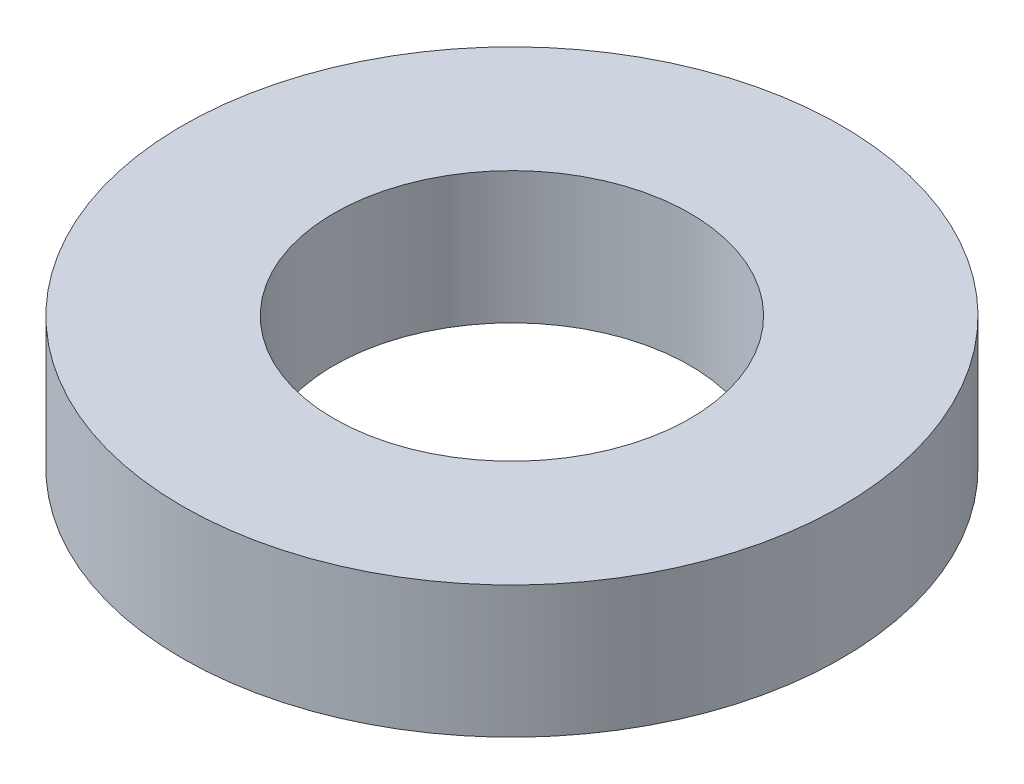
ISO-10303-21;
HEADER;
FILE_DESCRIPTION(('STEP AP214'),'2;1');
FILE_NAME('part.step','',(''),(''),'','','');
FILE_SCHEMA(('AUTOMOTIVE_DESIGN { 1 0 10303 214 1 1 1 1 }'));
ENDSEC;
DATA;
#1=APPLICATION_CONTEXT('core data for automotive mechanical design processes');
#2=APPLICATION_PROTOCOL_DEFINITION('international standard','automotive_design',2000,#1);
#3=PRODUCT_CONTEXT('',#1,'mechanical');
#4=PRODUCT('Part','Part','',(#3));
#5=PRODUCT_RELATED_PRODUCT_CATEGORY('part','',(#4));
#6=PRODUCT_DEFINITION_FORMATION('','',#4);
#7=PRODUCT_DEFINITION_CONTEXT('part definition',#1,'design');
#8=PRODUCT_DEFINITION('design','',#6,#7);
#9=PRODUCT_DEFINITION_SHAPE('','',#8);
#10=(LENGTH_UNIT() NAMED_UNIT(*) SI_UNIT(.MILLI.,.METRE.));
#11=(NAMED_UNIT(*) PLANE_ANGLE_UNIT() SI_UNIT($,.RADIAN.));
#12=(NAMED_UNIT(*) SI_UNIT($,.STERADIAN.) SOLID_ANGLE_UNIT());
#13=UNCERTAINTY_MEASURE_WITH_UNIT(LENGTH_MEASURE(1.E-05),#10,'distance_accuracy_value','');
#14=(GEOMETRIC_REPRESENTATION_CONTEXT(3) GLOBAL_UNCERTAINTY_ASSIGNED_CONTEXT((#13)) GLOBAL_UNIT_ASSIGNED_CONTEXT((#10,
#11,#12)) REPRESENTATION_CONTEXT('',''));
#15=CARTESIAN_POINT('',(0.,0.,0.));
#16=DIRECTION('',(0.,0.,1.));
#17=DIRECTION('',(1.,0.,0.));
#18=AXIS2_PLACEMENT_3D('',#15,#16,#17);
#19=CARTESIAN_POINT('',(0.,2.,0.));
#20=DIRECTION('',(0.,1.,0.));
#21=DIRECTION('',(0.,0.,1.));
#22=AXIS2_PLACEMENT_3D('',#19,#20,#21);
#23=PLANE('',#22);
#24=CARTESIAN_POINT('',(0.,2.,0.));
#25=DIRECTION('',(0.,1.,0.));
#26=DIRECTION('',(0.,0.,1.));
#27=AXIS2_PLACEMENT_3D('',#24,#25,#26);
#28=CIRCLE('',#27,5.);
#29=CARTESIAN_POINT('',(0.,2.,5.));
#30=VERTEX_POINT('',#29);
#31=EDGE_CURVE('E10',#30,#30,#28,.T.);
#32=ORIENTED_EDGE('',*,*,#31,.T.);
#33=EDGE_LOOP('',(#32));
#34=FACE_BOUND('',#33,.T.);
#35=CARTESIAN_POINT('',(0.,2.,0.));
#36=DIRECTION('',(0.,1.,0.));
#37=DIRECTION('',(0.,0.,1.));
#38=AXIS2_PLACEMENT_3D('',#35,#36,#37);
#39=CIRCLE('',#38,2.7);
#40=CARTESIAN_POINT('',(0.,2.,2.7));
#41=VERTEX_POINT('',#40);
#42=EDGE_CURVE('E42',#41,#41,#39,.T.);
#43=ORIENTED_EDGE('',*,*,#42,.F.);
#44=EDGE_LOOP('',(#43));
#45=FACE_BOUND('',#44,.T.);
#46=ADVANCED_FACE('F31',(#34,#45),#23,.T.);
#47=CARTESIAN_POINT('',(0.,0.,0.));
#48=DIRECTION('',(0.,1.,0.));
#49=DIRECTION('',(0.,0.,1.));
#50=AXIS2_PLACEMENT_3D('',#47,#48,#49);
#51=PLANE('',#50);
#52=CARTESIAN_POINT('',(0.,0.,0.));
#53=DIRECTION('',(0.,1.,0.));
#54=DIRECTION('',(0.,0.,1.));
#55=AXIS2_PLACEMENT_3D('',#52,#53,#54);
#56=CIRCLE('',#55,5.);
#57=CARTESIAN_POINT('',(0.,0.,5.));
#58=VERTEX_POINT('',#57);
#59=EDGE_CURVE('E35',#58,#58,#56,.T.);
#60=ORIENTED_EDGE('',*,*,#59,.F.);
#61=EDGE_LOOP('',(#60));
#62=FACE_BOUND('',#61,.T.);
#63=CARTESIAN_POINT('',(0.,0.,0.));
#64=DIRECTION('',(0.,1.,0.));
#65=DIRECTION('',(0.,0.,1.));
#66=AXIS2_PLACEMENT_3D('',#63,#64,#65);
#67=CIRCLE('',#66,2.7);
#68=CARTESIAN_POINT('',(0.,0.,2.7));
#69=VERTEX_POINT('',#68);
#70=EDGE_CURVE('E44',#69,#69,#67,.T.);
#71=ORIENTED_EDGE('',*,*,#70,.T.);
#72=EDGE_LOOP('',(#71));
#73=FACE_BOUND('',#72,.T.);
#74=ADVANCED_FACE('F54',(#62,#73),#51,.F.);
#75=CARTESIAN_POINT('',(0.,2.,0.));
#76=DIRECTION('',(0.,-1.,0.));
#77=DIRECTION('',(0.,0.,-1.));
#78=AXIS2_PLACEMENT_3D('',#75,#76,#77);
#79=CYLINDRICAL_SURFACE('',#78,5.);
#80=ORIENTED_EDGE('',*,*,#31,.F.);
#81=EDGE_LOOP('',(#80));
#82=FACE_BOUND('',#81,.T.);
#83=ORIENTED_EDGE('',*,*,#59,.T.);
#84=EDGE_LOOP('',(#83));
#85=FACE_BOUND('',#84,.T.);
#86=ADVANCED_FACE('F33',(#82,#85),#79,.T.);
#87=CARTESIAN_POINT('',(0.,2.,0.));
#88=DIRECTION('',(0.,-1.,0.));
#89=DIRECTION('',(0.,0.,-1.));
#90=AXIS2_PLACEMENT_3D('',#87,#88,#89);
#91=CYLINDRICAL_SURFACE('',#90,2.7);
#92=ORIENTED_EDGE('',*,*,#42,.T.);
#93=EDGE_LOOP('',(#92));
#94=FACE_BOUND('',#93,.T.);
#95=ORIENTED_EDGE('',*,*,#70,.F.);
#96=EDGE_LOOP('',(#95));
#97=FACE_BOUND('',#96,.T.);
#98=ADVANCED_FACE('F50',(#94,#97),#91,.F.);
#99=CLOSED_SHELL('',(#46,#74,#86,#98));
#100=MANIFOLD_SOLID_BREP('B2',#99);
#101=ADVANCED_BREP_SHAPE_REPRESENTATION('',(#18,#100),#14);
#102=SHAPE_DEFINITION_REPRESENTATION(#9,#101);
ENDSEC;
END-ISO-10303-21;
